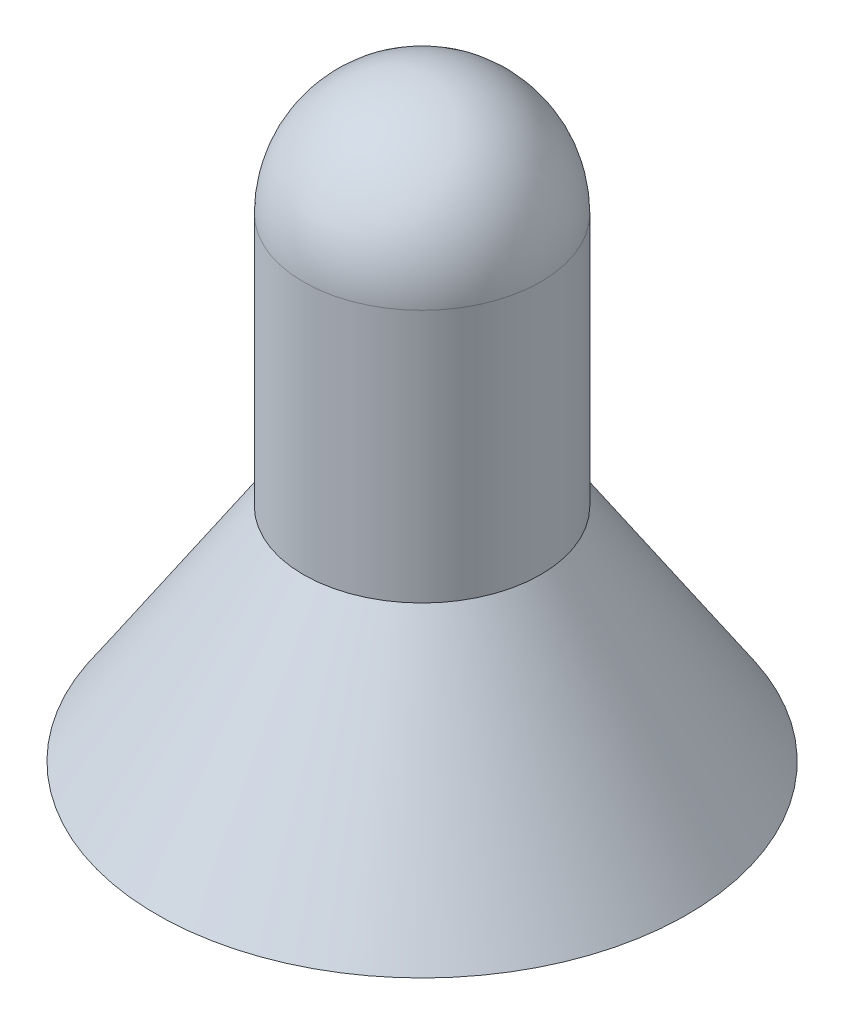
ISO-10303-21;
HEADER;
FILE_DESCRIPTION(('STEP AP214'),'2;1');
FILE_NAME('part.step','',(''),(''),'','','');
FILE_SCHEMA(('AUTOMOTIVE_DESIGN { 1 0 10303 214 1 1 1 1 }'));
ENDSEC;
DATA;
#1=APPLICATION_CONTEXT('core data for automotive mechanical design processes');
#2=APPLICATION_PROTOCOL_DEFINITION('international standard','automotive_design',2000,#1);
#3=PRODUCT_CONTEXT('',#1,'mechanical');
#4=PRODUCT('Part','Part','',(#3));
#5=PRODUCT_RELATED_PRODUCT_CATEGORY('part','',(#4));
#6=PRODUCT_DEFINITION_FORMATION('','',#4);
#7=PRODUCT_DEFINITION_CONTEXT('part definition',#1,'design');
#8=PRODUCT_DEFINITION('design','',#6,#7);
#9=PRODUCT_DEFINITION_SHAPE('','',#8);
#10=(LENGTH_UNIT() NAMED_UNIT(*) SI_UNIT(.MILLI.,.METRE.));
#11=(NAMED_UNIT(*) PLANE_ANGLE_UNIT() SI_UNIT($,.RADIAN.));
#12=(NAMED_UNIT(*) SI_UNIT($,.STERADIAN.) SOLID_ANGLE_UNIT());
#13=UNCERTAINTY_MEASURE_WITH_UNIT(LENGTH_MEASURE(1.E-05),#10,'distance_accuracy_value','');
#14=(GEOMETRIC_REPRESENTATION_CONTEXT(3) GLOBAL_UNCERTAINTY_ASSIGNED_CONTEXT((#13)) GLOBAL_UNIT_ASSIGNED_CONTEXT((#10,
#11,#12)) REPRESENTATION_CONTEXT('',''));
#15=CARTESIAN_POINT('',(0.,0.,0.));
#16=DIRECTION('',(0.,0.,1.));
#17=DIRECTION('',(1.,0.,0.));
#18=AXIS2_PLACEMENT_3D('',#15,#16,#17);
#19=CARTESIAN_POINT('',(0.,24.,0.));
#20=DIRECTION('',(0.,-1.,0.));
#21=DIRECTION('',(0.,0.,-1.));
#22=AXIS2_PLACEMENT_3D('',#19,#20,#21);
#23=SPHERICAL_SURFACE('',#22,20.);
#24=CARTESIAN_POINT('',(0.,35.0554159678514,0.));
#25=DIRECTION('',(0.,-1.,0.));
#26=DIRECTION('',(0.,0.,-1.));
#27=AXIS2_PLACEMENT_3D('',#24,#25,#26);
#28=CIRCLE('',#27,16.6666666666667);
#29=CARTESIAN_POINT('',(0.,35.0554159678514,-16.6666666666667));
#30=VERTEX_POINT('',#29);
#31=EDGE_CURVE('E10',#30,#30,#28,.T.);
#32=ORIENTED_EDGE('',*,*,#31,.T.);
#33=EDGE_LOOP('',(#32));
#34=FACE_BOUND('',#33,.T.);
#35=ADVANCED_FACE('F35',(#34),#23,.F.);
#36=CARTESIAN_POINT('',(0.,35.0554159678514,0.));
#37=DIRECTION('',(0.,-1.,0.));
#38=DIRECTION('',(0.,0.,-1.));
#39=AXIS2_PLACEMENT_3D('',#36,#37,#38);
#40=CONICAL_SURFACE('',#39,16.6666666666667,0.585685543457152);
#41=CARTESIAN_POINT('',(0.,0.,0.));
#42=DIRECTION('',(0.,-1.,0.));
#43=DIRECTION('',(0.,0.,-1.));
#44=AXIS2_PLACEMENT_3D('',#41,#42,#43);
#45=CIRCLE('',#44,39.919798993706);
#46=CARTESIAN_POINT('',(0.,0.,-39.919798993706));
#47=VERTEX_POINT('',#46);
#48=EDGE_CURVE('E41',#47,#47,#45,.T.);
#49=ORIENTED_EDGE('',*,*,#48,.T.);
#50=EDGE_LOOP('',(#49));
#51=FACE_BOUND('',#50,.T.);
#52=ORIENTED_EDGE('',*,*,#31,.F.);
#53=EDGE_LOOP('',(#52));
#54=FACE_BOUND('',#53,.T.);
#55=ADVANCED_FACE('F70',(#51,#54),#40,.F.);
#56=CARTESIAN_POINT('',(0.,0.,-39.919798993706));
#57=DIRECTION('',(0.,-1.,0.));
#58=DIRECTION('',(0.,0.,-1.));
#59=AXIS2_PLACEMENT_3D('',#56,#57,#58);
#60=PLANE('',#59);
#61=CARTESIAN_POINT('',(0.,0.,0.));
#62=DIRECTION('',(0.,-1.,0.));
#63=DIRECTION('',(0.,0.,-1.));
#64=AXIS2_PLACEMENT_3D('',#61,#62,#63);
#65=CIRCLE('',#64,44.7197989937059);
#66=CARTESIAN_POINT('',(0.,0.,-44.7197989937059));
#67=VERTEX_POINT('',#66);
#68=EDGE_CURVE('E45',#67,#67,#65,.T.);
#69=ORIENTED_EDGE('',*,*,#68,.T.);
#70=EDGE_LOOP('',(#69));
#71=FACE_BOUND('',#70,.T.);
#72=ORIENTED_EDGE('',*,*,#48,.F.);
#73=EDGE_LOOP('',(#72));
#74=FACE_BOUND('',#73,.T.);
#75=ADVANCED_FACE('F74',(#71,#74),#60,.T.);
#76=CARTESIAN_POINT('',(0.,37.2664991614216,0.));
#77=DIRECTION('',(0.,-1.,0.));
#78=DIRECTION('',(0.,0.,-1.));
#79=AXIS2_PLACEMENT_3D('',#76,#77,#78);
#80=CONICAL_SURFACE('',#79,20.,0.585685543457151);
#81=ORIENTED_EDGE('',*,*,#68,.F.);
#82=EDGE_LOOP('',(#81));
#83=FACE_BOUND('',#82,.T.);
#84=CARTESIAN_POINT('',(0.,37.2664991614216,0.));
#85=DIRECTION('',(0.,-1.,0.));
#86=DIRECTION('',(0.,0.,-1.));
#87=AXIS2_PLACEMENT_3D('',#84,#85,#86);
#88=CIRCLE('',#87,20.);
#89=CARTESIAN_POINT('',(0.,37.2664991614216,-20.));
#90=VERTEX_POINT('',#89);
#91=EDGE_CURVE('E49',#90,#90,#88,.T.);
#92=ORIENTED_EDGE('',*,*,#91,.T.);
#93=EDGE_LOOP('',(#92));
#94=FACE_BOUND('',#93,.T.);
#95=ADVANCED_FACE('F66',(#83,#94),#80,.T.);
#96=CARTESIAN_POINT('',(0.,44.,0.));
#97=DIRECTION('',(0.,-1.,0.));
#98=DIRECTION('',(0.,0.,-1.));
#99=AXIS2_PLACEMENT_3D('',#96,#97,#98);
#100=CYLINDRICAL_SURFACE('',#99,20.);
#101=ORIENTED_EDGE('',*,*,#91,.F.);
#102=EDGE_LOOP('',(#101));
#103=FACE_BOUND('',#102,.T.);
#104=CARTESIAN_POINT('',(0.,80.,0.));
#105=DIRECTION('',(0.,-1.,0.));
#106=DIRECTION('',(0.,0.,-1.));
#107=AXIS2_PLACEMENT_3D('',#104,#105,#106);
#108=CIRCLE('',#107,20.);
#109=CARTESIAN_POINT('',(0.,80.,-20.));
#110=VERTEX_POINT('',#109);
#111=EDGE_CURVE('E54',#110,#110,#108,.T.);
#112=ORIENTED_EDGE('',*,*,#111,.T.);
#113=EDGE_LOOP('',(#112));
#114=FACE_BOUND('',#113,.T.);
#115=ADVANCED_FACE('F58',(#103,#114),#100,.T.);
#116=CARTESIAN_POINT('',(0.,80.,0.));
#117=DIRECTION('',(0.,-1.,0.));
#118=DIRECTION('',(0.,0.,-1.));
#119=AXIS2_PLACEMENT_3D('',#116,#117,#118);
#120=SPHERICAL_SURFACE('',#119,20.);
#121=ORIENTED_EDGE('',*,*,#111,.F.);
#122=EDGE_LOOP('',(#121));
#123=FACE_BOUND('',#122,.T.);
#124=ADVANCED_FACE('F60',(#123),#120,.T.);
#125=CLOSED_SHELL('',(#35,#55,#75,#95,#115,#124));
#126=MANIFOLD_SOLID_BREP('B2',#125);
#127=ADVANCED_BREP_SHAPE_REPRESENTATION('',(#18,#126),#14);
#128=SHAPE_DEFINITION_REPRESENTATION(#9,#127);
ENDSEC;
END-ISO-10303-21;
